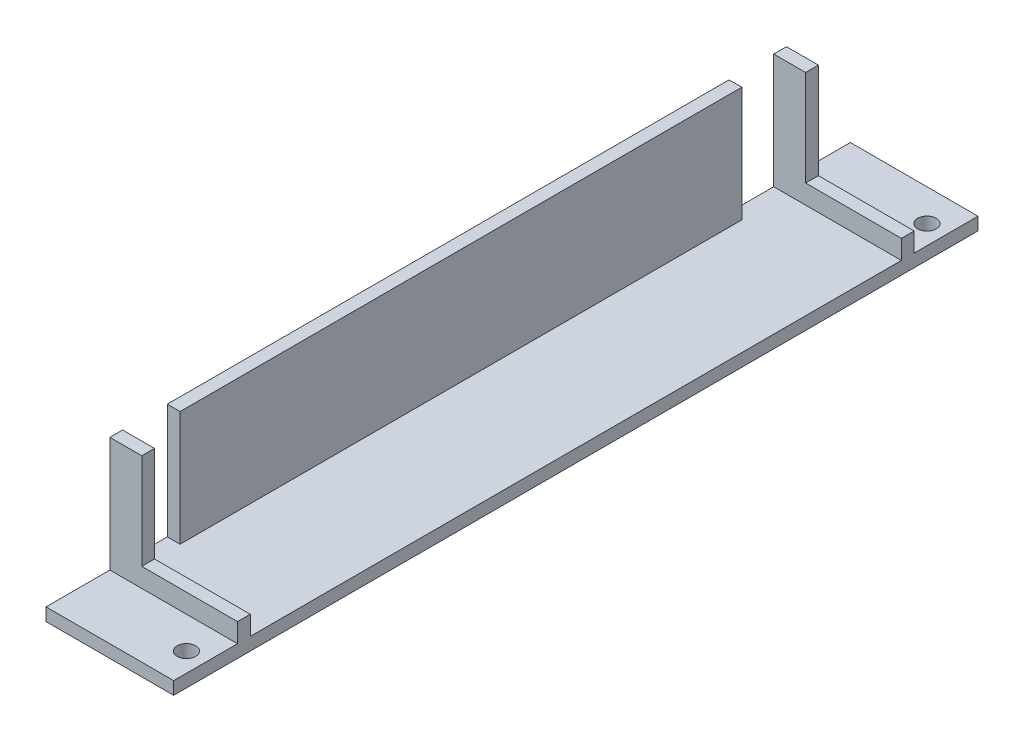
ISO-10303-21;
HEADER;
FILE_DESCRIPTION(('STEP AP214'),'2;1');
FILE_NAME('part.step','',(''),(''),'','','');
FILE_SCHEMA(('AUTOMOTIVE_DESIGN { 1 0 10303 214 1 1 1 1 }'));
ENDSEC;
DATA;
#1=APPLICATION_CONTEXT('core data for automotive mechanical design processes');
#2=APPLICATION_PROTOCOL_DEFINITION('international standard','automotive_design',2000,#1);
#3=PRODUCT_CONTEXT('',#1,'mechanical');
#4=PRODUCT('Part','Part','',(#3));
#5=PRODUCT_RELATED_PRODUCT_CATEGORY('part','',(#4));
#6=PRODUCT_DEFINITION_FORMATION('','',#4);
#7=PRODUCT_DEFINITION_CONTEXT('part definition',#1,'design');
#8=PRODUCT_DEFINITION('design','',#6,#7);
#9=PRODUCT_DEFINITION_SHAPE('','',#8);
#10=(LENGTH_UNIT() NAMED_UNIT(*) SI_UNIT(.MILLI.,.METRE.));
#11=(NAMED_UNIT(*) PLANE_ANGLE_UNIT() SI_UNIT($,.RADIAN.));
#12=(NAMED_UNIT(*) SI_UNIT($,.STERADIAN.) SOLID_ANGLE_UNIT());
#13=UNCERTAINTY_MEASURE_WITH_UNIT(LENGTH_MEASURE(1.E-05),#10,'distance_accuracy_value','');
#14=(GEOMETRIC_REPRESENTATION_CONTEXT(3) GLOBAL_UNCERTAINTY_ASSIGNED_CONTEXT((#13)) GLOBAL_UNIT_ASSIGNED_CONTEXT((#10,
#11,#12)) REPRESENTATION_CONTEXT('',''));
#15=CARTESIAN_POINT('',(0.,0.,0.));
#16=DIRECTION('',(0.,0.,1.));
#17=DIRECTION('',(1.,0.,0.));
#18=AXIS2_PLACEMENT_3D('',#15,#16,#17);
#19=CARTESIAN_POINT('',(-8.,2.,126.));
#20=DIRECTION('',(0.,-1.,0.));
#21=DIRECTION('',(1.,0.,0.));
#22=AXIS2_PLACEMENT_3D('',#19,#20,#21);
#23=PLANE('',#22);
#24=DIRECTION('',(0.,0.,-1.));
#25=VECTOR('',#24,1.);
#26=CARTESIAN_POINT('',(10.,2.,126.));
#27=LINE('',#26,#25);
#28=CARTESIAN_POINT('',(10.,2.,114.));
#29=VERTEX_POINT('',#28);
#30=CARTESIAN_POINT('',(10.,2.,12.));
#31=VERTEX_POINT('',#30);
#32=EDGE_CURVE('E41',#29,#31,#27,.T.);
#33=ORIENTED_EDGE('',*,*,#32,.T.);
#34=DIRECTION('',(-1.,0.,0.));
#35=VECTOR('',#34,1.);
#36=CARTESIAN_POINT('',(10.,1.99999999999999,12.));
#37=LINE('',#36,#35);
#38=CARTESIAN_POINT('',(-10.,1.99999999999999,12.));
#39=VERTEX_POINT('',#38);
#40=EDGE_CURVE('E49',#31,#39,#37,.T.);
#41=ORIENTED_EDGE('',*,*,#40,.T.);
#42=DIRECTION('',(0.,0.,1.));
#43=VECTOR('',#42,1.);
#44=CARTESIAN_POINT('',(-10.,1.99999999999999,12.));
#45=LINE('',#44,#43);
#46=CARTESIAN_POINT('',(-10.,1.99999999999999,19.));
#47=VERTEX_POINT('',#46);
#48=EDGE_CURVE('E272',#39,#47,#45,.T.);
#49=ORIENTED_EDGE('',*,*,#48,.T.);
#50=DIRECTION('',(-1.,0.,0.));
#51=VECTOR('',#50,1.);
#52=CARTESIAN_POINT('',(10.,1.99999999999999,19.));
#53=LINE('',#52,#51);
#54=CARTESIAN_POINT('',(-8.,1.99999999999999,19.));
#55=VERTEX_POINT('',#54);
#56=EDGE_CURVE('E279',#55,#47,#53,.T.);
#57=ORIENTED_EDGE('',*,*,#56,.F.);
#58=DIRECTION('',(0.,0.,-1.));
#59=VECTOR('',#58,1.);
#60=CARTESIAN_POINT('',(-8.,2.,126.));
#61=LINE('',#60,#59);
#62=CARTESIAN_POINT('',(-8.,2.,107.));
#63=VERTEX_POINT('',#62);
#64=EDGE_CURVE('E316',#63,#55,#61,.T.);
#65=ORIENTED_EDGE('',*,*,#64,.F.);
#66=DIRECTION('',(-1.,0.,0.));
#67=VECTOR('',#66,1.);
#68=CARTESIAN_POINT('',(10.,2.,107.));
#69=LINE('',#68,#67);
#70=CARTESIAN_POINT('',(-10.,2.,107.));
#71=VERTEX_POINT('',#70);
#72=EDGE_CURVE('E244',#63,#71,#69,.T.);
#73=ORIENTED_EDGE('',*,*,#72,.T.);
#74=DIRECTION('',(0.,0.,1.));
#75=VECTOR('',#74,1.);
#76=CARTESIAN_POINT('',(-10.,2.,107.));
#77=LINE('',#76,#75);
#78=CARTESIAN_POINT('',(-10.,2.,114.));
#79=VERTEX_POINT('',#78);
#80=EDGE_CURVE('E239',#71,#79,#77,.T.);
#81=ORIENTED_EDGE('',*,*,#80,.T.);
#82=DIRECTION('',(-1.,0.,0.));
#83=VECTOR('',#82,1.);
#84=CARTESIAN_POINT('',(10.,2.,114.));
#85=LINE('',#84,#83);
#86=EDGE_CURVE('E56',#29,#79,#85,.T.);
#87=ORIENTED_EDGE('',*,*,#86,.F.);
#88=EDGE_LOOP('',(#33,#41,#49,#57,#65,#73,#81,#87));
#89=FACE_BOUND('',#88,.T.);
#90=ADVANCED_FACE('F33',(#89),#23,.F.);
#91=CARTESIAN_POINT('',(7.,2.,5.));
#92=DIRECTION('',(0.,1.,0.));
#93=DIRECTION('',(0.,0.,1.));
#94=AXIS2_PLACEMENT_3D('',#91,#92,#93);
#95=CIRCLE('',#94,1.44999999999999);
#96=CARTESIAN_POINT('',(7.,2.,6.44999999999999));
#97=VERTEX_POINT('',#96);
#98=EDGE_CURVE('E647',#97,#97,#95,.T.);
#99=ORIENTED_EDGE('',*,*,#98,.F.);
#100=EDGE_LOOP('',(#99));
#101=FACE_BOUND('',#100,.T.);
#102=DIRECTION('',(-1.,0.,0.));
#103=VECTOR('',#102,1.);
#104=CARTESIAN_POINT('',(10.,2.,10.));
#105=LINE('',#104,#103);
#106=CARTESIAN_POINT('',(10.,2.,9.99999999999999));
#107=VERTEX_POINT('',#106);
#108=CARTESIAN_POINT('',(-10.,2.,10.));
#109=VERTEX_POINT('',#108);
#110=EDGE_CURVE('E240',#107,#109,#105,.T.);
#111=ORIENTED_EDGE('',*,*,#110,.F.);
#112=CARTESIAN_POINT('',(10.,2.,0.));
#113=VERTEX_POINT('',#112);
#114=EDGE_CURVE('E42',#107,#113,#27,.T.);
#115=ORIENTED_EDGE('',*,*,#114,.T.);
#116=DIRECTION('',(-1.,0.,0.));
#117=VECTOR('',#116,1.);
#118=CARTESIAN_POINT('',(-8.,2.,0.));
#119=LINE('',#118,#117);
#120=CARTESIAN_POINT('',(-10.,2.,0.));
#121=VERTEX_POINT('',#120);
#122=EDGE_CURVE('E301',#113,#121,#119,.T.);
#123=ORIENTED_EDGE('',*,*,#122,.T.);
#124=DIRECTION('',(0.,0.,1.));
#125=VECTOR('',#124,1.);
#126=CARTESIAN_POINT('',(-10.,2.,10.));
#127=LINE('',#126,#125);
#128=EDGE_CURVE('E256',#121,#109,#127,.T.);
#129=ORIENTED_EDGE('',*,*,#128,.T.);
#130=EDGE_LOOP('',(#111,#115,#123,#129));
#131=FACE_BOUND('',#130,.T.);
#132=ADVANCED_FACE('F397',(#101,#131),#23,.F.);
#133=CARTESIAN_POINT('',(-8.,20.,126.));
#134=DIRECTION('',(-1.,0.,0.));
#135=DIRECTION('',(0.,-1.,0.));
#136=AXIS2_PLACEMENT_3D('',#133,#134,#135);
#137=PLANE('',#136);
#138=DIRECTION('',(0.,0.,-1.));
#139=VECTOR('',#138,1.);
#140=CARTESIAN_POINT('',(-8.,20.,126.));
#141=LINE('',#140,#139);
#142=CARTESIAN_POINT('',(-8.,20.,107.));
#143=VERTEX_POINT('',#142);
#144=CARTESIAN_POINT('',(-8.,20.,19.));
#145=VERTEX_POINT('',#144);
#146=EDGE_CURVE('E314',#143,#145,#141,.T.);
#147=ORIENTED_EDGE('',*,*,#146,.F.);
#148=DIRECTION('',(0.,-1.,0.));
#149=VECTOR('',#148,1.);
#150=CARTESIAN_POINT('',(-8.,20.,107.));
#151=LINE('',#150,#149);
#152=EDGE_CURVE('E284',#143,#63,#151,.T.);
#153=ORIENTED_EDGE('',*,*,#152,.T.);
#154=ORIENTED_EDGE('',*,*,#64,.T.);
#155=DIRECTION('',(0.,1.,0.));
#156=VECTOR('',#155,1.);
#157=CARTESIAN_POINT('',(-8.,20.,19.));
#158=LINE('',#157,#156);
#159=EDGE_CURVE('E180',#55,#145,#158,.T.);
#160=ORIENTED_EDGE('',*,*,#159,.T.);
#161=EDGE_LOOP('',(#147,#153,#154,#160));
#162=FACE_BOUND('',#161,.T.);
#163=ADVANCED_FACE('F352',(#162),#137,.F.);
#164=CARTESIAN_POINT('',(-10.,20.,126.));
#165=DIRECTION('',(0.,-1.,0.));
#166=DIRECTION('',(0.,0.,-1.));
#167=AXIS2_PLACEMENT_3D('',#164,#165,#166);
#168=PLANE('',#167);
#169=DIRECTION('',(0.,0.,-1.));
#170=VECTOR('',#169,1.);
#171=CARTESIAN_POINT('',(-10.,20.,126.));
#172=LINE('',#171,#170);
#173=CARTESIAN_POINT('',(-10.,20.,107.));
#174=VERTEX_POINT('',#173);
#175=CARTESIAN_POINT('',(-10.,20.,19.));
#176=VERTEX_POINT('',#175);
#177=EDGE_CURVE('E312',#174,#176,#172,.T.);
#178=ORIENTED_EDGE('',*,*,#177,.F.);
#179=DIRECTION('',(-1.,0.,0.));
#180=VECTOR('',#179,1.);
#181=CARTESIAN_POINT('',(10.,20.,107.));
#182=LINE('',#181,#180);
#183=EDGE_CURVE('E245',#143,#174,#182,.T.);
#184=ORIENTED_EDGE('',*,*,#183,.F.);
#185=ORIENTED_EDGE('',*,*,#146,.T.);
#186=DIRECTION('',(-1.,0.,0.));
#187=VECTOR('',#186,1.);
#188=CARTESIAN_POINT('',(10.,20.,19.));
#189=LINE('',#188,#187);
#190=EDGE_CURVE('E181',#145,#176,#189,.T.);
#191=ORIENTED_EDGE('',*,*,#190,.T.);
#192=EDGE_LOOP('',(#178,#184,#185,#191));
#193=FACE_BOUND('',#192,.T.);
#194=ADVANCED_FACE('F356',(#193),#168,.F.);
#195=DIRECTION('',(-1.,0.,0.));
#196=VECTOR('',#195,1.);
#197=CARTESIAN_POINT('',(10.,20.,12.));
#198=LINE('',#197,#196);
#199=CARTESIAN_POINT('',(-5.,20.,12.));
#200=VERTEX_POINT('',#199);
#201=CARTESIAN_POINT('',(-10.,20.,12.));
#202=VERTEX_POINT('',#201);
#203=EDGE_CURVE('E171',#200,#202,#198,.T.);
#204=ORIENTED_EDGE('',*,*,#203,.F.);
#205=DIRECTION('',(0.,0.,-1.));
#206=VECTOR('',#205,1.);
#207=CARTESIAN_POINT('',(-5.,20.,12.));
#208=LINE('',#207,#206);
#209=CARTESIAN_POINT('',(-5.,20.,9.99999999999999));
#210=VERTEX_POINT('',#209);
#211=EDGE_CURVE('E176',#200,#210,#208,.T.);
#212=ORIENTED_EDGE('',*,*,#211,.T.);
#213=DIRECTION('',(-1.,0.,0.));
#214=VECTOR('',#213,1.);
#215=CARTESIAN_POINT('',(10.,20.,10.));
#216=LINE('',#215,#214);
#217=CARTESIAN_POINT('',(-10.,20.,10.));
#218=VERTEX_POINT('',#217);
#219=EDGE_CURVE('E260',#210,#218,#216,.T.);
#220=ORIENTED_EDGE('',*,*,#219,.T.);
#221=EDGE_CURVE('E178',#202,#218,#172,.T.);
#222=ORIENTED_EDGE('',*,*,#221,.F.);
#223=EDGE_LOOP('',(#204,#212,#220,#222));
#224=FACE_BOUND('',#223,.T.);
#225=ADVANCED_FACE('F173',(#224),#168,.F.);
#226=CARTESIAN_POINT('',(10.,2.,126.));
#227=DIRECTION('',(-1.,0.,0.));
#228=DIRECTION('',(0.,-1.,0.));
#229=AXIS2_PLACEMENT_3D('',#226,#227,#228);
#230=PLANE('',#229);
#231=DIRECTION('',(0.,1.,0.));
#232=VECTOR('',#231,1.);
#233=CARTESIAN_POINT('',(10.,2.,0.));
#234=LINE('',#233,#232);
#235=CARTESIAN_POINT('',(10.,0.,0.));
#236=VERTEX_POINT('',#235);
#237=EDGE_CURVE('E287',#236,#113,#234,.T.);
#238=ORIENTED_EDGE('',*,*,#237,.T.);
#239=ORIENTED_EDGE('',*,*,#114,.F.);
#240=DIRECTION('',(0.,1.,0.));
#241=VECTOR('',#240,1.);
#242=CARTESIAN_POINT('',(10.,5.,9.99999999999999));
#243=LINE('',#242,#241);
#244=CARTESIAN_POINT('',(10.,5.,9.99999999999999));
#245=VERTEX_POINT('',#244);
#246=EDGE_CURVE('E191',#107,#245,#243,.T.);
#247=ORIENTED_EDGE('',*,*,#246,.T.);
#248=DIRECTION('',(0.,0.,-1.));
#249=VECTOR('',#248,1.);
#250=CARTESIAN_POINT('',(10.,5.,12.));
#251=LINE('',#250,#249);
#252=CARTESIAN_POINT('',(10.,5.,12.));
#253=VERTEX_POINT('',#252);
#254=EDGE_CURVE('E200',#253,#245,#251,.T.);
#255=ORIENTED_EDGE('',*,*,#254,.F.);
#256=DIRECTION('',(0.,1.,0.));
#257=VECTOR('',#256,1.);
#258=CARTESIAN_POINT('',(10.,5.,12.));
#259=LINE('',#258,#257);
#260=EDGE_CURVE('E198',#31,#253,#259,.T.);
#261=ORIENTED_EDGE('',*,*,#260,.F.);
#262=ORIENTED_EDGE('',*,*,#32,.F.);
#263=DIRECTION('',(0.,1.,0.));
#264=VECTOR('',#263,1.);
#265=CARTESIAN_POINT('',(10.,5.,114.));
#266=LINE('',#265,#264);
#267=CARTESIAN_POINT('',(10.,5.,114.));
#268=VERTEX_POINT('',#267);
#269=EDGE_CURVE('E212',#29,#268,#266,.T.);
#270=ORIENTED_EDGE('',*,*,#269,.T.);
#271=DIRECTION('',(0.,0.,1.));
#272=VECTOR('',#271,1.);
#273=CARTESIAN_POINT('',(10.,5.,114.));
#274=LINE('',#273,#272);
#275=CARTESIAN_POINT('',(10.,5.,116.));
#276=VERTEX_POINT('',#275);
#277=EDGE_CURVE('E222',#268,#276,#274,.T.);
#278=ORIENTED_EDGE('',*,*,#277,.T.);
#279=DIRECTION('',(0.,1.,0.));
#280=VECTOR('',#279,1.);
#281=CARTESIAN_POINT('',(10.,5.,116.));
#282=LINE('',#281,#280);
#283=CARTESIAN_POINT('',(10.,2.,116.));
#284=VERTEX_POINT('',#283);
#285=EDGE_CURVE('E211',#284,#276,#282,.T.);
#286=ORIENTED_EDGE('',*,*,#285,.F.);
#287=CARTESIAN_POINT('',(10.,2.,126.));
#288=VERTEX_POINT('',#287);
#289=EDGE_CURVE('E11',#288,#284,#27,.T.);
#290=ORIENTED_EDGE('',*,*,#289,.F.);
#291=DIRECTION('',(0.,1.,0.));
#292=VECTOR('',#291,1.);
#293=CARTESIAN_POINT('',(10.,2.,126.));
#294=LINE('',#293,#292);
#295=CARTESIAN_POINT('',(10.,0.,126.));
#296=VERTEX_POINT('',#295);
#297=EDGE_CURVE('E288',#296,#288,#294,.T.);
#298=ORIENTED_EDGE('',*,*,#297,.F.);
#299=DIRECTION('',(0.,0.,-1.));
#300=VECTOR('',#299,1.);
#301=CARTESIAN_POINT('',(10.,0.,126.));
#302=LINE('',#301,#300);
#303=EDGE_CURVE('E298',#296,#236,#302,.T.);
#304=ORIENTED_EDGE('',*,*,#303,.T.);
#305=EDGE_LOOP('',(#238,#239,#247,#255,#261,#262,#270,#278,#286,#290,#298,#304));
#306=FACE_BOUND('',#305,.T.);
#307=ADVANCED_FACE('F35',(#306),#230,.F.);
#308=CARTESIAN_POINT('',(7.,2.,121.));
#309=DIRECTION('',(0.,1.,0.));
#310=DIRECTION('',(0.,0.,1.));
#311=AXIS2_PLACEMENT_3D('',#308,#309,#310);
#312=CIRCLE('',#311,1.44999999999999);
#313=CARTESIAN_POINT('',(7.,2.,122.45));
#314=VERTEX_POINT('',#313);
#315=EDGE_CURVE('E205',#314,#314,#312,.T.);
#316=ORIENTED_EDGE('',*,*,#315,.F.);
#317=EDGE_LOOP('',(#316));
#318=FACE_BOUND('',#317,.T.);
#319=ORIENTED_EDGE('',*,*,#289,.T.);
#320=DIRECTION('',(-1.,0.,0.));
#321=VECTOR('',#320,1.);
#322=CARTESIAN_POINT('',(10.,2.00000000000002,116.));
#323=LINE('',#322,#321);
#324=CARTESIAN_POINT('',(-10.,2.00000000000002,116.));
#325=VERTEX_POINT('',#324);
#326=EDGE_CURVE('E268',#284,#325,#323,.T.);
#327=ORIENTED_EDGE('',*,*,#326,.T.);
#328=DIRECTION('',(0.,0.,1.));
#329=VECTOR('',#328,1.);
#330=CARTESIAN_POINT('',(-10.,2.00000000000002,116.));
#331=LINE('',#330,#329);
#332=CARTESIAN_POINT('',(-10.,2.,126.));
#333=VERTEX_POINT('',#332);
#334=EDGE_CURVE('E265',#325,#333,#331,.T.);
#335=ORIENTED_EDGE('',*,*,#334,.T.);
#336=DIRECTION('',(-1.,0.,0.));
#337=VECTOR('',#336,1.);
#338=CARTESIAN_POINT('',(-8.,2.,126.));
#339=LINE('',#338,#337);
#340=EDGE_CURVE('E291',#288,#333,#339,.T.);
#341=ORIENTED_EDGE('',*,*,#340,.F.);
#342=EDGE_LOOP('',(#319,#327,#335,#341));
#343=FACE_BOUND('',#342,.T.);
#344=ADVANCED_FACE('F385',(#318,#343),#23,.F.);
#345=CARTESIAN_POINT('',(-10.,20.,116.));
#346=VERTEX_POINT('',#345);
#347=CARTESIAN_POINT('',(-10.,20.,114.));
#348=VERTEX_POINT('',#347);
#349=EDGE_CURVE('E313',#346,#348,#172,.T.);
#350=ORIENTED_EDGE('',*,*,#349,.F.);
#351=DIRECTION('',(-1.,0.,0.));
#352=VECTOR('',#351,1.);
#353=CARTESIAN_POINT('',(10.,20.,116.));
#354=LINE('',#353,#352);
#355=CARTESIAN_POINT('',(-5.,20.,116.));
#356=VERTEX_POINT('',#355);
#357=EDGE_CURVE('E257',#356,#346,#354,.T.);
#358=ORIENTED_EDGE('',*,*,#357,.F.);
#359=DIRECTION('',(0.,0.,1.));
#360=VECTOR('',#359,1.);
#361=CARTESIAN_POINT('',(-5.,20.,114.));
#362=LINE('',#361,#360);
#363=CARTESIAN_POINT('',(-5.,20.,114.));
#364=VERTEX_POINT('',#363);
#365=EDGE_CURVE('E230',#364,#356,#362,.T.);
#366=ORIENTED_EDGE('',*,*,#365,.F.);
#367=DIRECTION('',(-1.,0.,0.));
#368=VECTOR('',#367,1.);
#369=CARTESIAN_POINT('',(10.,20.,114.));
#370=LINE('',#369,#368);
#371=EDGE_CURVE('E248',#364,#348,#370,.T.);
#372=ORIENTED_EDGE('',*,*,#371,.T.);
#373=EDGE_LOOP('',(#350,#358,#366,#372));
#374=FACE_BOUND('',#373,.T.);
#375=ADVANCED_FACE('F370',(#374),#168,.F.);
#376=CARTESIAN_POINT('',(-10.,0.,126.));
#377=DIRECTION('',(1.,0.,0.));
#378=DIRECTION('',(0.,1.,0.));
#379=AXIS2_PLACEMENT_3D('',#376,#377,#378);
#380=PLANE('',#379);
#381=DIRECTION('',(0.,1.,0.));
#382=VECTOR('',#381,1.);
#383=CARTESIAN_POINT('',(-10.,20.,10.));
#384=LINE('',#383,#382);
#385=EDGE_CURVE('E254',#109,#218,#384,.T.);
#386=ORIENTED_EDGE('',*,*,#385,.F.);
#387=ORIENTED_EDGE('',*,*,#128,.F.);
#388=DIRECTION('',(0.,-1.,0.));
#389=VECTOR('',#388,1.);
#390=CARTESIAN_POINT('',(-10.,0.,0.));
#391=LINE('',#390,#389);
#392=CARTESIAN_POINT('',(-10.,0.,0.));
#393=VERTEX_POINT('',#392);
#394=EDGE_CURVE('E303',#121,#393,#391,.T.);
#395=ORIENTED_EDGE('',*,*,#394,.T.);
#396=DIRECTION('',(0.,0.,-1.));
#397=VECTOR('',#396,1.);
#398=CARTESIAN_POINT('',(-10.,0.,126.));
#399=LINE('',#398,#397);
#400=CARTESIAN_POINT('',(-10.,0.,126.));
#401=VERTEX_POINT('',#400);
#402=EDGE_CURVE('E308',#401,#393,#399,.T.);
#403=ORIENTED_EDGE('',*,*,#402,.F.);
#404=DIRECTION('',(0.,-1.,0.));
#405=VECTOR('',#404,1.);
#406=CARTESIAN_POINT('',(-10.,0.,126.));
#407=LINE('',#406,#405);
#408=EDGE_CURVE('E294',#333,#401,#407,.T.);
#409=ORIENTED_EDGE('',*,*,#408,.F.);
#410=ORIENTED_EDGE('',*,*,#334,.F.);
#411=DIRECTION('',(0.,-1.,0.));
#412=VECTOR('',#411,1.);
#413=CARTESIAN_POINT('',(-10.,20.,116.));
#414=LINE('',#413,#412);
#415=EDGE_CURVE('E233',#346,#325,#414,.T.);
#416=ORIENTED_EDGE('',*,*,#415,.F.);
#417=ORIENTED_EDGE('',*,*,#349,.T.);
#418=DIRECTION('',(0.,1.,0.));
#419=VECTOR('',#418,1.);
#420=CARTESIAN_POINT('',(-10.,20.,114.));
#421=LINE('',#420,#419);
#422=EDGE_CURVE('E242',#79,#348,#421,.T.);
#423=ORIENTED_EDGE('',*,*,#422,.F.);
#424=ORIENTED_EDGE('',*,*,#80,.F.);
#425=DIRECTION('',(0.,-1.,0.));
#426=VECTOR('',#425,1.);
#427=CARTESIAN_POINT('',(-10.,20.,107.));
#428=LINE('',#427,#426);
#429=EDGE_CURVE('E237',#174,#71,#428,.T.);
#430=ORIENTED_EDGE('',*,*,#429,.F.);
#431=ORIENTED_EDGE('',*,*,#177,.T.);
#432=DIRECTION('',(0.,1.,0.));
#433=VECTOR('',#432,1.);
#434=CARTESIAN_POINT('',(-10.,20.,19.));
#435=LINE('',#434,#433);
#436=EDGE_CURVE('E275',#47,#176,#435,.T.);
#437=ORIENTED_EDGE('',*,*,#436,.F.);
#438=ORIENTED_EDGE('',*,*,#48,.F.);
#439=DIRECTION('',(0.,-1.,0.));
#440=VECTOR('',#439,1.);
#441=CARTESIAN_POINT('',(-10.,20.,12.));
#442=LINE('',#441,#440);
#443=EDGE_CURVE('E247',#202,#39,#442,.T.);
#444=ORIENTED_EDGE('',*,*,#443,.F.);
#445=ORIENTED_EDGE('',*,*,#221,.T.);
#446=EDGE_LOOP('',(#386,#387,#395,#403,#409,#410,#416,#417,#423,#424,#430,#431,#437,#438,#444,#445));
#447=FACE_BOUND('',#446,.T.);
#448=ADVANCED_FACE('F344',(#447),#380,.F.);
#449=CARTESIAN_POINT('',(-10.,0.,126.));
#450=DIRECTION('',(0.,1.,0.));
#451=DIRECTION('',(0.,0.,1.));
#452=AXIS2_PLACEMENT_3D('',#449,#450,#451);
#453=PLANE('',#452);
#454=CARTESIAN_POINT('',(7.,0.,5.));
#455=DIRECTION('',(0.,1.,0.));
#456=DIRECTION('',(0.,0.,1.));
#457=AXIS2_PLACEMENT_3D('',#454,#455,#456);
#458=CIRCLE('',#457,1.45);
#459=CARTESIAN_POINT('',(7.,0.,6.45));
#460=VERTEX_POINT('',#459);
#461=EDGE_CURVE('E338',#460,#460,#458,.T.);
#462=ORIENTED_EDGE('',*,*,#461,.T.);
#463=EDGE_LOOP('',(#462));
#464=FACE_BOUND('',#463,.T.);
#465=CARTESIAN_POINT('',(7.,0.,121.));
#466=DIRECTION('',(0.,1.,0.));
#467=DIRECTION('',(0.,0.,1.));
#468=AXIS2_PLACEMENT_3D('',#465,#466,#467);
#469=CIRCLE('',#468,1.45);
#470=CARTESIAN_POINT('',(7.,0.,122.45));
#471=VERTEX_POINT('',#470);
#472=EDGE_CURVE('E208',#471,#471,#469,.T.);
#473=ORIENTED_EDGE('',*,*,#472,.T.);
#474=EDGE_LOOP('',(#473));
#475=FACE_BOUND('',#474,.T.);
#476=DIRECTION('',(1.,0.,0.));
#477=VECTOR('',#476,1.);
#478=CARTESIAN_POINT('',(-10.,0.,0.));
#479=LINE('',#478,#477);
#480=EDGE_CURVE('E292',#393,#236,#479,.T.);
#481=ORIENTED_EDGE('',*,*,#480,.T.);
#482=ORIENTED_EDGE('',*,*,#303,.F.);
#483=DIRECTION('',(1.,0.,0.));
#484=VECTOR('',#483,1.);
#485=CARTESIAN_POINT('',(-10.,0.,126.));
#486=LINE('',#485,#484);
#487=EDGE_CURVE('E296',#401,#296,#486,.T.);
#488=ORIENTED_EDGE('',*,*,#487,.F.);
#489=ORIENTED_EDGE('',*,*,#402,.T.);
#490=EDGE_LOOP('',(#481,#482,#488,#489));
#491=FACE_BOUND('',#490,.T.);
#492=ADVANCED_FACE('F399',(#464,#475,#491),#453,.F.);
#493=CARTESIAN_POINT('',(0.,0.,126.));
#494=DIRECTION('',(0.,0.,1.));
#495=DIRECTION('',(1.,0.,0.));
#496=AXIS2_PLACEMENT_3D('',#493,#494,#495);
#497=PLANE('',#496);
#498=ORIENTED_EDGE('',*,*,#340,.T.);
#499=ORIENTED_EDGE('',*,*,#408,.T.);
#500=ORIENTED_EDGE('',*,*,#487,.T.);
#501=ORIENTED_EDGE('',*,*,#297,.T.);
#502=EDGE_LOOP('',(#498,#499,#500,#501));
#503=FACE_BOUND('',#502,.T.);
#504=ADVANCED_FACE('F388',(#503),#497,.T.);
#505=CARTESIAN_POINT('',(0.,0.,0.));
#506=DIRECTION('',(0.,0.,1.));
#507=DIRECTION('',(1.,0.,0.));
#508=AXIS2_PLACEMENT_3D('',#505,#506,#507);
#509=PLANE('',#508);
#510=ORIENTED_EDGE('',*,*,#394,.F.);
#511=ORIENTED_EDGE('',*,*,#122,.F.);
#512=ORIENTED_EDGE('',*,*,#237,.F.);
#513=ORIENTED_EDGE('',*,*,#480,.F.);
#514=EDGE_LOOP('',(#510,#511,#512,#513));
#515=FACE_BOUND('',#514,.T.);
#516=ADVANCED_FACE('F396',(#515),#509,.F.);
#517=CARTESIAN_POINT('',(10.,20.,10.));
#518=DIRECTION('',(0.,0.,1.));
#519=DIRECTION('',(0.,-1.,0.));
#520=AXIS2_PLACEMENT_3D('',#517,#518,#519);
#521=PLANE('',#520);
#522=ORIENTED_EDGE('',*,*,#110,.T.);
#523=ORIENTED_EDGE('',*,*,#385,.T.);
#524=ORIENTED_EDGE('',*,*,#219,.F.);
#525=DIRECTION('',(0.,1.,0.));
#526=VECTOR('',#525,1.);
#527=CARTESIAN_POINT('',(-5.,20.,9.99999999999999));
#528=LINE('',#527,#526);
#529=CARTESIAN_POINT('',(-5.,5.,9.99999999999999));
#530=VERTEX_POINT('',#529);
#531=EDGE_CURVE('E196',#530,#210,#528,.T.);
#532=ORIENTED_EDGE('',*,*,#531,.F.);
#533=DIRECTION('',(-1.,0.,0.));
#534=VECTOR('',#533,1.);
#535=CARTESIAN_POINT('',(-5.,5.,9.99999999999999));
#536=LINE('',#535,#534);
#537=EDGE_CURVE('E337',#245,#530,#536,.T.);
#538=ORIENTED_EDGE('',*,*,#537,.F.);
#539=ORIENTED_EDGE('',*,*,#246,.F.);
#540=EDGE_LOOP('',(#522,#523,#524,#532,#538,#539));
#541=FACE_BOUND('',#540,.T.);
#542=ADVANCED_FACE('F341',(#541),#521,.F.);
#543=CARTESIAN_POINT('',(10.,20.,116.));
#544=DIRECTION('',(0.,0.,-1.));
#545=DIRECTION('',(-1.,0.,0.));
#546=AXIS2_PLACEMENT_3D('',#543,#544,#545);
#547=PLANE('',#546);
#548=ORIENTED_EDGE('',*,*,#357,.T.);
#549=ORIENTED_EDGE('',*,*,#415,.T.);
#550=ORIENTED_EDGE('',*,*,#326,.F.);
#551=ORIENTED_EDGE('',*,*,#285,.T.);
#552=DIRECTION('',(-1.,0.,0.));
#553=VECTOR('',#552,1.);
#554=CARTESIAN_POINT('',(-5.,5.,116.));
#555=LINE('',#554,#553);
#556=CARTESIAN_POINT('',(-5.,5.,116.));
#557=VERTEX_POINT('',#556);
#558=EDGE_CURVE('E225',#276,#557,#555,.T.);
#559=ORIENTED_EDGE('',*,*,#558,.T.);
#560=DIRECTION('',(0.,1.,0.));
#561=VECTOR('',#560,1.);
#562=CARTESIAN_POINT('',(-5.,20.,116.));
#563=LINE('',#562,#561);
#564=EDGE_CURVE('E216',#557,#356,#563,.T.);
#565=ORIENTED_EDGE('',*,*,#564,.T.);
#566=EDGE_LOOP('',(#548,#549,#550,#551,#559,#565));
#567=FACE_BOUND('',#566,.T.);
#568=ADVANCED_FACE('F382',(#567),#547,.F.);
#569=CARTESIAN_POINT('',(10.,20.,12.));
#570=DIRECTION('',(0.,0.,-1.));
#571=DIRECTION('',(0.,1.,0.));
#572=AXIS2_PLACEMENT_3D('',#569,#570,#571);
#573=PLANE('',#572);
#574=ORIENTED_EDGE('',*,*,#203,.T.);
#575=ORIENTED_EDGE('',*,*,#443,.T.);
#576=ORIENTED_EDGE('',*,*,#40,.F.);
#577=ORIENTED_EDGE('',*,*,#260,.T.);
#578=DIRECTION('',(-1.,0.,0.));
#579=VECTOR('',#578,1.);
#580=CARTESIAN_POINT('',(-5.,5.,12.));
#581=LINE('',#580,#579);
#582=CARTESIAN_POINT('',(-5.,5.,12.));
#583=VERTEX_POINT('',#582);
#584=EDGE_CURVE('E187',#253,#583,#581,.T.);
#585=ORIENTED_EDGE('',*,*,#584,.T.);
#586=DIRECTION('',(0.,1.,0.));
#587=VECTOR('',#586,1.);
#588=CARTESIAN_POINT('',(-5.,20.,12.));
#589=LINE('',#588,#587);
#590=EDGE_CURVE('E184',#583,#200,#589,.T.);
#591=ORIENTED_EDGE('',*,*,#590,.T.);
#592=EDGE_LOOP('',(#574,#575,#576,#577,#585,#591));
#593=FACE_BOUND('',#592,.T.);
#594=ADVANCED_FACE('F185',(#593),#573,.F.);
#595=CARTESIAN_POINT('',(10.,20.,19.));
#596=DIRECTION('',(0.,0.,1.));
#597=DIRECTION('',(1.,0.,0.));
#598=AXIS2_PLACEMENT_3D('',#595,#596,#597);
#599=PLANE('',#598);
#600=ORIENTED_EDGE('',*,*,#56,.T.);
#601=ORIENTED_EDGE('',*,*,#436,.T.);
#602=ORIENTED_EDGE('',*,*,#190,.F.);
#603=ORIENTED_EDGE('',*,*,#159,.F.);
#604=EDGE_LOOP('',(#600,#601,#602,#603));
#605=FACE_BOUND('',#604,.T.);
#606=ADVANCED_FACE('F350',(#605),#599,.F.);
#607=CARTESIAN_POINT('',(10.,20.,107.));
#608=DIRECTION('',(0.,0.,-1.));
#609=DIRECTION('',(-1.,0.,0.));
#610=AXIS2_PLACEMENT_3D('',#607,#608,#609);
#611=PLANE('',#610);
#612=ORIENTED_EDGE('',*,*,#183,.T.);
#613=ORIENTED_EDGE('',*,*,#429,.T.);
#614=ORIENTED_EDGE('',*,*,#72,.F.);
#615=ORIENTED_EDGE('',*,*,#152,.F.);
#616=EDGE_LOOP('',(#612,#613,#614,#615));
#617=FACE_BOUND('',#616,.T.);
#618=ADVANCED_FACE('F359',(#617),#611,.F.);
#619=CARTESIAN_POINT('',(10.,20.,114.));
#620=DIRECTION('',(0.,0.,1.));
#621=DIRECTION('',(1.,0.,0.));
#622=AXIS2_PLACEMENT_3D('',#619,#620,#621);
#623=PLANE('',#622);
#624=ORIENTED_EDGE('',*,*,#86,.T.);
#625=ORIENTED_EDGE('',*,*,#422,.T.);
#626=ORIENTED_EDGE('',*,*,#371,.F.);
#627=DIRECTION('',(0.,1.,0.));
#628=VECTOR('',#627,1.);
#629=CARTESIAN_POINT('',(-5.,20.,114.));
#630=LINE('',#629,#628);
#631=CARTESIAN_POINT('',(-5.,5.,114.));
#632=VERTEX_POINT('',#631);
#633=EDGE_CURVE('E219',#632,#364,#630,.T.);
#634=ORIENTED_EDGE('',*,*,#633,.F.);
#635=DIRECTION('',(-1.,0.,0.));
#636=VECTOR('',#635,1.);
#637=CARTESIAN_POINT('',(-5.,5.,114.));
#638=LINE('',#637,#636);
#639=EDGE_CURVE('E215',#268,#632,#638,.T.);
#640=ORIENTED_EDGE('',*,*,#639,.F.);
#641=ORIENTED_EDGE('',*,*,#269,.F.);
#642=EDGE_LOOP('',(#624,#625,#626,#634,#640,#641));
#643=FACE_BOUND('',#642,.T.);
#644=ADVANCED_FACE('F366',(#643),#623,.F.);
#645=CARTESIAN_POINT('',(-5.,20.,114.));
#646=DIRECTION('',(1.,0.,0.));
#647=DIRECTION('',(0.,1.,0.));
#648=AXIS2_PLACEMENT_3D('',#645,#646,#647);
#649=PLANE('',#648);
#650=ORIENTED_EDGE('',*,*,#564,.F.);
#651=DIRECTION('',(0.,0.,1.));
#652=VECTOR('',#651,1.);
#653=CARTESIAN_POINT('',(-5.,5.,114.));
#654=LINE('',#653,#652);
#655=EDGE_CURVE('E234',#632,#557,#654,.T.);
#656=ORIENTED_EDGE('',*,*,#655,.F.);
#657=ORIENTED_EDGE('',*,*,#633,.T.);
#658=ORIENTED_EDGE('',*,*,#365,.T.);
#659=EDGE_LOOP('',(#650,#656,#657,#658));
#660=FACE_BOUND('',#659,.T.);
#661=ADVANCED_FACE('F373',(#660),#649,.T.);
#662=CARTESIAN_POINT('',(-5.,5.,114.));
#663=DIRECTION('',(0.,1.,0.));
#664=DIRECTION('',(0.,0.,1.));
#665=AXIS2_PLACEMENT_3D('',#662,#663,#664);
#666=PLANE('',#665);
#667=ORIENTED_EDGE('',*,*,#558,.F.);
#668=ORIENTED_EDGE('',*,*,#277,.F.);
#669=ORIENTED_EDGE('',*,*,#639,.T.);
#670=ORIENTED_EDGE('',*,*,#655,.T.);
#671=EDGE_LOOP('',(#667,#668,#669,#670));
#672=FACE_BOUND('',#671,.T.);
#673=ADVANCED_FACE('F377',(#672),#666,.T.);
#674=CARTESIAN_POINT('',(7.,2.,121.));
#675=DIRECTION('',(0.,1.,0.));
#676=DIRECTION('',(0.,0.,1.));
#677=AXIS2_PLACEMENT_3D('',#674,#675,#676);
#678=CYLINDRICAL_SURFACE('',#677,1.44999999999999);
#679=ORIENTED_EDGE('',*,*,#472,.F.);
#680=EDGE_LOOP('',(#679));
#681=FACE_BOUND('',#680,.T.);
#682=ORIENTED_EDGE('',*,*,#315,.T.);
#683=EDGE_LOOP('',(#682));
#684=FACE_BOUND('',#683,.T.);
#685=ADVANCED_FACE('F427',(#681,#684),#678,.F.);
#686=CARTESIAN_POINT('',(-5.,5.,12.));
#687=DIRECTION('',(0.,-1.,0.));
#688=DIRECTION('',(0.,0.,-1.));
#689=AXIS2_PLACEMENT_3D('',#686,#687,#688);
#690=PLANE('',#689);
#691=ORIENTED_EDGE('',*,*,#537,.T.);
#692=DIRECTION('',(0.,0.,-1.));
#693=VECTOR('',#692,1.);
#694=CARTESIAN_POINT('',(-5.,5.,12.));
#695=LINE('',#694,#693);
#696=EDGE_CURVE('E197',#583,#530,#695,.T.);
#697=ORIENTED_EDGE('',*,*,#696,.F.);
#698=ORIENTED_EDGE('',*,*,#584,.F.);
#699=ORIENTED_EDGE('',*,*,#254,.T.);
#700=EDGE_LOOP('',(#691,#697,#698,#699));
#701=FACE_BOUND('',#700,.T.);
#702=ADVANCED_FACE('F332',(#701),#690,.F.);
#703=CARTESIAN_POINT('',(-5.,20.,12.));
#704=DIRECTION('',(-1.,0.,0.));
#705=DIRECTION('',(0.,-1.,0.));
#706=AXIS2_PLACEMENT_3D('',#703,#704,#705);
#707=PLANE('',#706);
#708=ORIENTED_EDGE('',*,*,#531,.T.);
#709=ORIENTED_EDGE('',*,*,#211,.F.);
#710=ORIENTED_EDGE('',*,*,#590,.F.);
#711=ORIENTED_EDGE('',*,*,#696,.T.);
#712=EDGE_LOOP('',(#708,#709,#710,#711));
#713=FACE_BOUND('',#712,.T.);
#714=ADVANCED_FACE('F194',(#713),#707,.F.);
#715=CARTESIAN_POINT('',(7.,2.,5.));
#716=DIRECTION('',(0.,1.,0.));
#717=DIRECTION('',(0.,0.,1.));
#718=AXIS2_PLACEMENT_3D('',#715,#716,#717);
#719=CYLINDRICAL_SURFACE('',#718,1.44999999999999);
#720=ORIENTED_EDGE('',*,*,#461,.F.);
#721=EDGE_LOOP('',(#720));
#722=FACE_BOUND('',#721,.T.);
#723=ORIENTED_EDGE('',*,*,#98,.T.);
#724=EDGE_LOOP('',(#723));
#725=FACE_BOUND('',#724,.T.);
#726=ADVANCED_FACE('F631',(#722,#725),#719,.F.);
#727=CLOSED_SHELL('',(#90,#132,#163,#194,#225,#307,#344,#375,#448,#492,#504,#516,#542,#568,#594,
#606,#618,#644,#661,#673,#685,#702,#714,#726));
#728=MANIFOLD_SOLID_BREP('B2',#727);
#729=ADVANCED_BREP_SHAPE_REPRESENTATION('',(#18,#728),#14);
#730=SHAPE_DEFINITION_REPRESENTATION(#9,#729);
ENDSEC;
END-ISO-10303-21;
